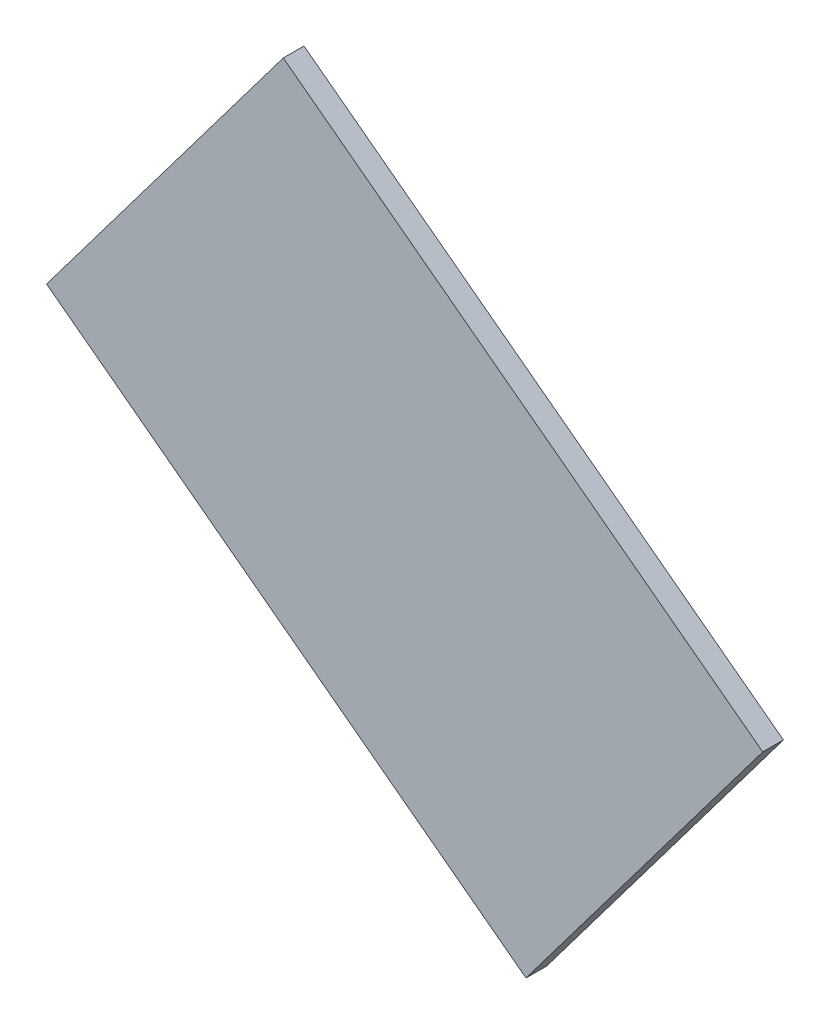
ISO-10303-21;
HEADER;
FILE_DESCRIPTION(('STEP AP214'),'2;1');
FILE_NAME('part.step','',(''),(''),'','','');
FILE_SCHEMA(('AUTOMOTIVE_DESIGN { 1 0 10303 214 1 1 1 1 }'));
ENDSEC;
DATA;
#1=APPLICATION_CONTEXT('core data for automotive mechanical design processes');
#2=APPLICATION_PROTOCOL_DEFINITION('international standard','automotive_design',2000,#1);
#3=PRODUCT_CONTEXT('',#1,'mechanical');
#4=PRODUCT('Part','Part','',(#3));
#5=PRODUCT_RELATED_PRODUCT_CATEGORY('part','',(#4));
#6=PRODUCT_DEFINITION_FORMATION('','',#4);
#7=PRODUCT_DEFINITION_CONTEXT('part definition',#1,'design');
#8=PRODUCT_DEFINITION('design','',#6,#7);
#9=PRODUCT_DEFINITION_SHAPE('','',#8);
#10=(LENGTH_UNIT() NAMED_UNIT(*) SI_UNIT(.MILLI.,.METRE.));
#11=(NAMED_UNIT(*) PLANE_ANGLE_UNIT() SI_UNIT($,.RADIAN.));
#12=(NAMED_UNIT(*) SI_UNIT($,.STERADIAN.) SOLID_ANGLE_UNIT());
#13=UNCERTAINTY_MEASURE_WITH_UNIT(LENGTH_MEASURE(1.E-05),#10,'distance_accuracy_value','');
#14=(GEOMETRIC_REPRESENTATION_CONTEXT(3) GLOBAL_UNCERTAINTY_ASSIGNED_CONTEXT((#13)) GLOBAL_UNIT_ASSIGNED_CONTEXT((#10,
#11,#12)) REPRESENTATION_CONTEXT('',''));
#15=CARTESIAN_POINT('',(0.,0.,0.));
#16=DIRECTION('',(0.,0.,1.));
#17=DIRECTION('',(1.,0.,0.));
#18=AXIS2_PLACEMENT_3D('',#15,#16,#17);
#19=CARTESIAN_POINT('',(-11.13512778385,13.943035245121,0.5));
#20=DIRECTION('',(0.,0.,1.));
#21=DIRECTION('',(1.,0.,0.));
#22=AXIS2_PLACEMENT_3D('',#19,#20,#21);
#23=PLANE('',#22);
#24=DIRECTION('',(-0.601815088128829,-0.798635461083773,0.));
#25=VECTOR('',#24,1.);
#26=CARTESIAN_POINT('',(-12.29314920242,14.815667122908,0.5));
#27=LINE('',#26,#25);
#28=CARTESIAN_POINT('',(-12.8648735361405,14.056963434879,0.5));
#29=VERTEX_POINT('',#28);
#30=CARTESIAN_POINT('',(-12.2931492024203,14.8156671229076,0.5));
#31=VERTEX_POINT('',#30);
#32=EDGE_CURVE('E76',#29,#31,#27,.F.);
#33=ORIENTED_EDGE('',*,*,#32,.F.);
#34=DIRECTION('',(0.798635461083773,-0.601815088128829,0.));
#35=VECTOR('',#34,1.);
#36=CARTESIAN_POINT('',(-11.70685211757,13.184331557092,0.5));
#37=LINE('',#36,#35);
#38=CARTESIAN_POINT('',(-11.7068521175706,13.1843315570925,0.5));
#39=VERTEX_POINT('',#38);
#40=EDGE_CURVE('E58',#39,#29,#37,.F.);
#41=ORIENTED_EDGE('',*,*,#40,.F.);
#42=DIRECTION('',(-0.601815088128829,-0.798635461083773,0.));
#43=VECTOR('',#42,1.);
#44=CARTESIAN_POINT('',(-11.13512778385,13.943035245121,0.5));
#45=LINE('',#44,#43);
#46=CARTESIAN_POINT('',(-11.13512778385,13.943035245121,0.5));
#47=VERTEX_POINT('',#46);
#48=EDGE_CURVE('E20',#39,#47,#45,.F.);
#49=ORIENTED_EDGE('',*,*,#48,.T.);
#50=DIRECTION('',(0.798635461083773,-0.601815088128829,0.));
#51=VECTOR('',#50,1.);
#52=CARTESIAN_POINT('',(-11.13512778385,13.943035245121,0.5));
#53=LINE('',#52,#51);
#54=EDGE_CURVE('E55',#47,#31,#53,.F.);
#55=ORIENTED_EDGE('',*,*,#54,.T.);
#56=EDGE_LOOP('',(#33,#41,#49,#55));
#57=FACE_BOUND('',#56,.T.);
#58=ADVANCED_FACE('F17',(#57),#23,.T.);
#59=CARTESIAN_POINT('',(-11.13512778385,13.943035245121,0.45));
#60=DIRECTION('',(-0.798635461083773,0.601815088128829,0.));
#61=DIRECTION('',(-0.601815088128829,-0.798635461083773,0.));
#62=AXIS2_PLACEMENT_3D('',#59,#60,#61);
#63=PLANE('',#62);
#64=DIRECTION('',(0.,0.,1.));
#65=VECTOR('',#64,1.);
#66=CARTESIAN_POINT('',(-11.70685211757,13.184331557092,0.45));
#67=LINE('',#66,#65);
#68=CARTESIAN_POINT('',(-11.7068521175706,13.1843315570925,0.45));
#69=VERTEX_POINT('',#68);
#70=EDGE_CURVE('E78',#69,#39,#67,.T.);
#71=ORIENTED_EDGE('',*,*,#70,.F.);
#72=DIRECTION('',(0.601815088127521,0.798635461084758,0.));
#73=VECTOR('',#72,1.);
#74=CARTESIAN_POINT('',(-11.70685211757,13.184331557092,0.45));
#75=LINE('',#74,#73);
#76=CARTESIAN_POINT('',(-11.13512778385,13.943035245121,0.45));
#77=VERTEX_POINT('',#76);
#78=EDGE_CURVE('E73',#69,#77,#75,.T.);
#79=ORIENTED_EDGE('',*,*,#78,.T.);
#80=DIRECTION('',(0.,0.,1.));
#81=VECTOR('',#80,1.);
#82=CARTESIAN_POINT('',(-11.13512778385,13.943035245121,0.45));
#83=LINE('',#82,#81);
#84=EDGE_CURVE('E63',#77,#47,#83,.T.);
#85=ORIENTED_EDGE('',*,*,#84,.T.);
#86=ORIENTED_EDGE('',*,*,#48,.F.);
#87=EDGE_LOOP('',(#71,#79,#85,#86));
#88=FACE_BOUND('',#87,.T.);
#89=ADVANCED_FACE('F72',(#88),#63,.F.);
#90=CARTESIAN_POINT('',(-11.13512778385,13.943035245121,0.45));
#91=DIRECTION('',(-0.601815088128829,-0.798635461083773,0.));
#92=DIRECTION('',(0.798635461083773,-0.601815088128829,0.));
#93=AXIS2_PLACEMENT_3D('',#90,#91,#92);
#94=PLANE('',#93);
#95=ORIENTED_EDGE('',*,*,#54,.F.);
#96=ORIENTED_EDGE('',*,*,#84,.F.);
#97=DIRECTION('',(-0.798635461083339,0.601815088129404,0.));
#98=VECTOR('',#97,1.);
#99=CARTESIAN_POINT('',(-11.13512778385,13.943035245121,0.45));
#100=LINE('',#99,#98);
#101=CARTESIAN_POINT('',(-12.2931492024203,14.8156671229076,0.45));
#102=VERTEX_POINT('',#101);
#103=EDGE_CURVE('E83',#77,#102,#100,.T.);
#104=ORIENTED_EDGE('',*,*,#103,.T.);
#105=DIRECTION('',(0.,0.,1.));
#106=VECTOR('',#105,1.);
#107=CARTESIAN_POINT('',(-12.29314920242,14.815667122908,0.45));
#108=LINE('',#107,#106);
#109=EDGE_CURVE('E69',#31,#102,#108,.F.);
#110=ORIENTED_EDGE('',*,*,#109,.F.);
#111=EDGE_LOOP('',(#95,#96,#104,#110));
#112=FACE_BOUND('',#111,.T.);
#113=ADVANCED_FACE('F66',(#112),#94,.F.);
#114=CARTESIAN_POINT('',(-12.29314920242,14.815667122908,0.45));
#115=DIRECTION('',(-0.798635461083773,0.601815088128829,0.));
#116=DIRECTION('',(-0.601815088128829,-0.798635461083773,0.));
#117=AXIS2_PLACEMENT_3D('',#114,#115,#116);
#118=PLANE('',#117);
#119=DIRECTION('',(0.,0.,1.));
#120=VECTOR('',#119,1.);
#121=CARTESIAN_POINT('',(-12.8648735361406,14.0569634348782,0.45));
#122=LINE('',#121,#120);
#123=CARTESIAN_POINT('',(-12.8648735361408,14.0569634348793,0.45));
#124=VERTEX_POINT('',#123);
#125=EDGE_CURVE('E34',#29,#124,#122,.F.);
#126=ORIENTED_EDGE('',*,*,#125,.F.);
#127=ORIENTED_EDGE('',*,*,#32,.T.);
#128=ORIENTED_EDGE('',*,*,#109,.T.);
#129=DIRECTION('',(-0.60181508812752,-0.798635461084759,0.));
#130=VECTOR('',#129,1.);
#131=CARTESIAN_POINT('',(-12.29314920242,14.815667122908,0.45));
#132=LINE('',#131,#130);
#133=EDGE_CURVE('E26',#102,#124,#132,.T.);
#134=ORIENTED_EDGE('',*,*,#133,.T.);
#135=EDGE_LOOP('',(#126,#127,#128,#134));
#136=FACE_BOUND('',#135,.T.);
#137=ADVANCED_FACE('F88',(#136),#118,.T.);
#138=CARTESIAN_POINT('',(-11.70685211757,13.184331557092,0.45));
#139=DIRECTION('',(-0.601815088128829,-0.798635461083773,0.));
#140=DIRECTION('',(0.798635461083773,-0.601815088128829,0.));
#141=AXIS2_PLACEMENT_3D('',#138,#139,#140);
#142=PLANE('',#141);
#143=ORIENTED_EDGE('',*,*,#40,.T.);
#144=ORIENTED_EDGE('',*,*,#125,.T.);
#145=DIRECTION('',(0.79863546108334,-0.601815088129403,0.));
#146=VECTOR('',#145,1.);
#147=CARTESIAN_POINT('',(-12.86487353614,14.056963434879,0.45));
#148=LINE('',#147,#146);
#149=EDGE_CURVE('E11',#124,#69,#148,.T.);
#150=ORIENTED_EDGE('',*,*,#149,.T.);
#151=ORIENTED_EDGE('',*,*,#70,.T.);
#152=EDGE_LOOP('',(#143,#144,#150,#151));
#153=FACE_BOUND('',#152,.T.);
#154=ADVANCED_FACE('F91',(#153),#142,.T.);
#155=CARTESIAN_POINT('',(-11.13512778385,13.943035245121,0.45));
#156=DIRECTION('',(0.,0.,1.));
#157=DIRECTION('',(1.,0.,0.));
#158=AXIS2_PLACEMENT_3D('',#155,#156,#157);
#159=PLANE('',#158);
#160=ORIENTED_EDGE('',*,*,#133,.F.);
#161=ORIENTED_EDGE('',*,*,#103,.F.);
#162=ORIENTED_EDGE('',*,*,#78,.F.);
#163=ORIENTED_EDGE('',*,*,#149,.F.);
#164=EDGE_LOOP('',(#160,#161,#162,#163));
#165=FACE_BOUND('',#164,.T.);
#166=ADVANCED_FACE('F90',(#165),#159,.F.);
#167=CLOSED_SHELL('',(#58,#89,#113,#137,#154,#166));
#168=MANIFOLD_SOLID_BREP('B1',#167);
#169=ADVANCED_BREP_SHAPE_REPRESENTATION('',(#18,#168),#14);
#170=SHAPE_DEFINITION_REPRESENTATION(#9,#169);
ENDSEC;
END-ISO-10303-21;
